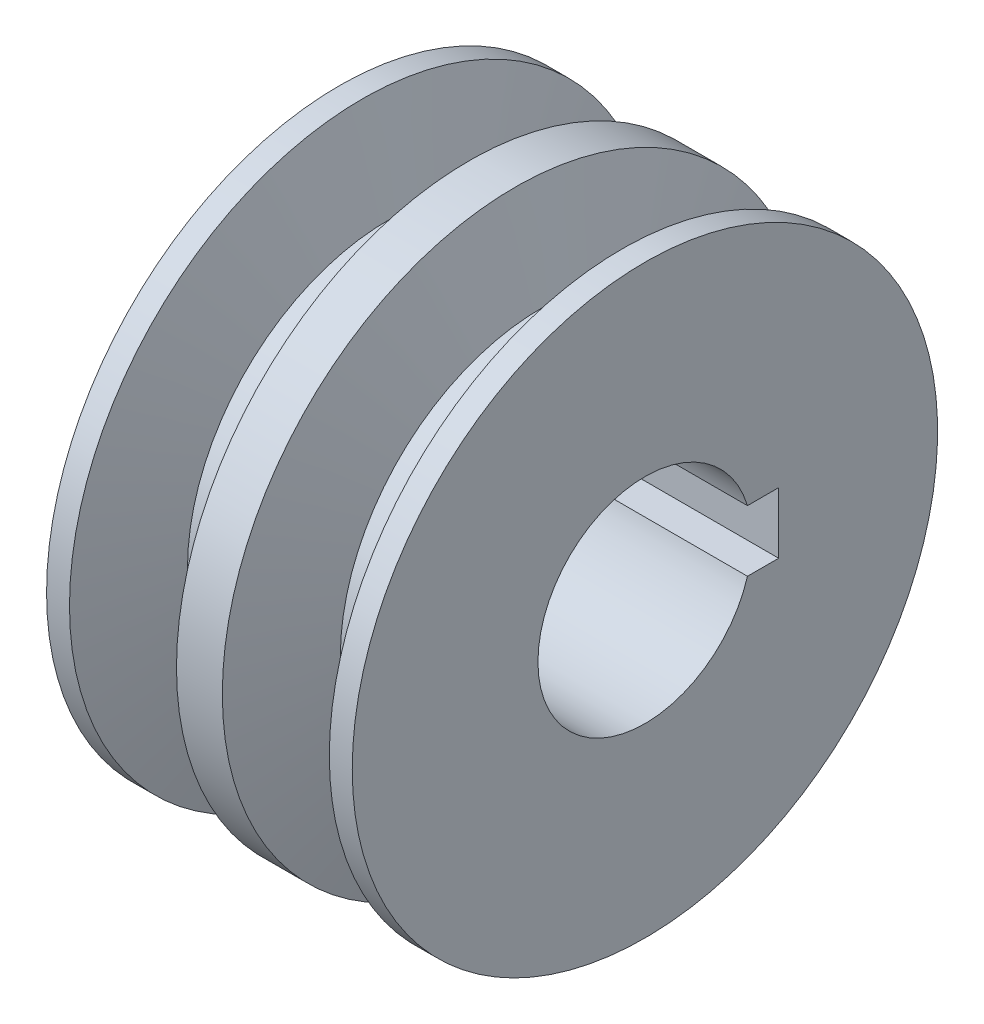
ISO-10303-21;
HEADER;
FILE_DESCRIPTION(('STEP AP214'),'2;1');
FILE_NAME('part.step','',(''),(''),'','','');
FILE_SCHEMA(('AUTOMOTIVE_DESIGN { 1 0 10303 214 1 1 1 1 }'));
ENDSEC;
DATA;
#1=APPLICATION_CONTEXT('core data for automotive mechanical design processes');
#2=APPLICATION_PROTOCOL_DEFINITION('international standard','automotive_design',2000,#1);
#3=PRODUCT_CONTEXT('',#1,'mechanical');
#4=PRODUCT('Part','Part','',(#3));
#5=PRODUCT_RELATED_PRODUCT_CATEGORY('part','',(#4));
#6=PRODUCT_DEFINITION_FORMATION('','',#4);
#7=PRODUCT_DEFINITION_CONTEXT('part definition',#1,'design');
#8=PRODUCT_DEFINITION('design','',#6,#7);
#9=PRODUCT_DEFINITION_SHAPE('','',#8);
#10=(LENGTH_UNIT() NAMED_UNIT(*) SI_UNIT(.MILLI.,.METRE.));
#11=(NAMED_UNIT(*) PLANE_ANGLE_UNIT() SI_UNIT($,.RADIAN.));
#12=(NAMED_UNIT(*) SI_UNIT($,.STERADIAN.) SOLID_ANGLE_UNIT());
#13=UNCERTAINTY_MEASURE_WITH_UNIT(LENGTH_MEASURE(1.E-05),#10,'distance_accuracy_value','');
#14=(GEOMETRIC_REPRESENTATION_CONTEXT(3) GLOBAL_UNCERTAINTY_ASSIGNED_CONTEXT((#13)) GLOBAL_UNIT_ASSIGNED_CONTEXT((#10,
#11,#12)) REPRESENTATION_CONTEXT('',''));
#15=CARTESIAN_POINT('',(0.,0.,0.));
#16=DIRECTION('',(0.,0.,1.));
#17=DIRECTION('',(1.,0.,0.));
#18=AXIS2_PLACEMENT_3D('',#15,#16,#17);
#19=CARTESIAN_POINT('',(985.254127108371,38.3000000000001,414.673045166986));
#20=DIRECTION('',(1.,0.,0.));
#21=DIRECTION('',(0.,0.,-1.));
#22=AXIS2_PLACEMENT_3D('',#19,#20,#21);
#23=PLANE('',#22);
#24=CARTESIAN_POINT('',(985.254127108371,0.,414.673045166986));
#25=DIRECTION('',(-1.,0.,0.));
#26=DIRECTION('',(0.,0.,1.));
#27=AXIS2_PLACEMENT_3D('',#24,#25,#26);
#28=CIRCLE('',#27,38.3000000000001);
#29=CARTESIAN_POINT('',(985.254127108371,0.,452.973045166986));
#30=VERTEX_POINT('',#29);
#31=EDGE_CURVE('E11',#30,#30,#28,.T.);
#32=ORIENTED_EDGE('',*,*,#31,.F.);
#33=EDGE_LOOP('',(#32));
#34=FACE_BOUND('',#33,.T.);
#35=DIRECTION('',(0.,-1.,0.));
#36=VECTOR('',#35,1.);
#37=CARTESIAN_POINT('',(985.254127108371,0.,397.173045166986));
#38=LINE('',#37,#36);
#39=CARTESIAN_POINT('',(985.254127108371,4.,397.173045166986));
#40=VERTEX_POINT('',#39);
#41=CARTESIAN_POINT('',(985.254127108371,-4.,397.173045166986));
#42=VERTEX_POINT('',#41);
#43=EDGE_CURVE('E92',#40,#42,#38,.T.);
#44=ORIENTED_EDGE('',*,*,#43,.T.);
#45=DIRECTION('',(0.,0.,1.));
#46=VECTOR('',#45,1.);
#47=CARTESIAN_POINT('',(985.254127108371,-4.,-1.29601113280521E-12));
#48=LINE('',#47,#46);
#49=CARTESIAN_POINT('',(985.254127108371,-4.,401.256637301987));
#50=VERTEX_POINT('',#49);
#51=EDGE_CURVE('E98',#42,#50,#48,.T.);
#52=ORIENTED_EDGE('',*,*,#51,.T.);
#53=CARTESIAN_POINT('',(985.254127108371,0.,414.673045166986));
#54=DIRECTION('',(1.,0.,0.));
#55=DIRECTION('',(0.,0.,-1.));
#56=AXIS2_PLACEMENT_3D('',#53,#54,#55);
#57=CIRCLE('',#56,14.);
#58=CARTESIAN_POINT('',(985.254127108371,4.,401.256637301987));
#59=VERTEX_POINT('',#58);
#60=EDGE_CURVE('E103',#59,#50,#57,.T.);
#61=ORIENTED_EDGE('',*,*,#60,.F.);
#62=DIRECTION('',(0.,0.,-1.));
#63=VECTOR('',#62,1.);
#64=CARTESIAN_POINT('',(985.254127108371,4.,-1.29601113280521E-12));
#65=LINE('',#64,#63);
#66=EDGE_CURVE('E48',#59,#40,#65,.T.);
#67=ORIENTED_EDGE('',*,*,#66,.T.);
#68=EDGE_LOOP('',(#44,#52,#61,#67));
#69=FACE_BOUND('',#68,.T.);
#70=ADVANCED_FACE('F33',(#34,#69),#23,.T.);
#71=CARTESIAN_POINT('',(945.254127108371,0.,414.673045166986));
#72=DIRECTION('',(-1.,0.,0.));
#73=DIRECTION('',(0.,0.,1.));
#74=AXIS2_PLACEMENT_3D('',#71,#72,#73);
#75=PLANE('',#74);
#76=CARTESIAN_POINT('',(945.254127108371,0.,414.673045166986));
#77=DIRECTION('',(-1.,0.,0.));
#78=DIRECTION('',(0.,0.,1.));
#79=AXIS2_PLACEMENT_3D('',#76,#77,#78);
#80=CIRCLE('',#79,38.3);
#81=CARTESIAN_POINT('',(945.254127108371,0.,452.973045166986));
#82=VERTEX_POINT('',#81);
#83=EDGE_CURVE('E41',#82,#82,#80,.T.);
#84=ORIENTED_EDGE('',*,*,#83,.T.);
#85=EDGE_LOOP('',(#84));
#86=FACE_BOUND('',#85,.T.);
#87=CARTESIAN_POINT('',(945.254127108371,0.,414.673045166986));
#88=DIRECTION('',(1.,0.,0.));
#89=DIRECTION('',(0.,0.,-1.));
#90=AXIS2_PLACEMENT_3D('',#87,#88,#89);
#91=CIRCLE('',#90,14.);
#92=CARTESIAN_POINT('',(945.254127108371,4.,401.256637301987));
#93=VERTEX_POINT('',#92);
#94=CARTESIAN_POINT('',(945.254127108371,-4.,401.256637301987));
#95=VERTEX_POINT('',#94);
#96=EDGE_CURVE('E106',#93,#95,#91,.T.);
#97=ORIENTED_EDGE('',*,*,#96,.T.);
#98=DIRECTION('',(0.,0.,1.));
#99=VECTOR('',#98,1.);
#100=CARTESIAN_POINT('',(945.254127108371,-4.,-1.24049998157395E-12));
#101=LINE('',#100,#99);
#102=CARTESIAN_POINT('',(945.254127108371,-4.,397.173045166986));
#103=VERTEX_POINT('',#102);
#104=EDGE_CURVE('E57',#103,#95,#101,.T.);
#105=ORIENTED_EDGE('',*,*,#104,.F.);
#106=DIRECTION('',(0.,-1.,0.));
#107=VECTOR('',#106,1.);
#108=CARTESIAN_POINT('',(945.254127108371,0.,397.173045166986));
#109=LINE('',#108,#107);
#110=CARTESIAN_POINT('',(945.254127108371,4.,397.173045166986));
#111=VERTEX_POINT('',#110);
#112=EDGE_CURVE('E77',#111,#103,#109,.T.);
#113=ORIENTED_EDGE('',*,*,#112,.F.);
#114=DIRECTION('',(0.,0.,-1.));
#115=VECTOR('',#114,1.);
#116=CARTESIAN_POINT('',(945.254127108371,4.,-1.24049998157395E-12));
#117=LINE('',#116,#115);
#118=EDGE_CURVE('E80',#93,#111,#117,.T.);
#119=ORIENTED_EDGE('',*,*,#118,.F.);
#120=EDGE_LOOP('',(#97,#105,#113,#119));
#121=FACE_BOUND('',#120,.T.);
#122=ADVANCED_FACE('F94',(#86,#121),#75,.T.);
#123=CARTESIAN_POINT('',(945.254127108371,0.,414.673045166986));
#124=DIRECTION('',(1.,0.,0.));
#125=DIRECTION('',(0.,0.,-1.));
#126=AXIS2_PLACEMENT_3D('',#123,#124,#125);
#127=CYLINDRICAL_SURFACE('',#126,14.);
#128=DIRECTION('',(1.,0.,0.));
#129=VECTOR('',#128,1.);
#130=CARTESIAN_POINT('',(945.254127108371,-4.,401.256637301987));
#131=LINE('',#130,#129);
#132=EDGE_CURVE('E70',#95,#50,#131,.T.);
#133=ORIENTED_EDGE('',*,*,#132,.F.);
#134=ORIENTED_EDGE('',*,*,#96,.F.);
#135=DIRECTION('',(1.,0.,0.));
#136=VECTOR('',#135,1.);
#137=CARTESIAN_POINT('',(945.254127108371,4.,401.256637301987));
#138=LINE('',#137,#136);
#139=EDGE_CURVE('E84',#93,#59,#138,.T.);
#140=ORIENTED_EDGE('',*,*,#139,.T.);
#141=ORIENTED_EDGE('',*,*,#60,.T.);
#142=EDGE_LOOP('',(#133,#134,#140,#141));
#143=FACE_BOUND('',#142,.T.);
#144=ADVANCED_FACE('F149',(#143),#127,.F.);
#145=CARTESIAN_POINT('',(985.254127108371,0.,414.673045166986));
#146=DIRECTION('',(-1.,0.,0.));
#147=DIRECTION('',(0.,0.,1.));
#148=AXIS2_PLACEMENT_3D('',#145,#146,#147);
#149=CYLINDRICAL_SURFACE('',#148,38.3);
#150=ORIENTED_EDGE('',*,*,#31,.T.);
#151=EDGE_LOOP('',(#150));
#152=FACE_BOUND('',#151,.T.);
#153=CARTESIAN_POINT('',(982.254127108371,0.,414.673045166986));
#154=DIRECTION('',(-1.,0.,0.));
#155=DIRECTION('',(0.,0.,1.));
#156=AXIS2_PLACEMENT_3D('',#153,#154,#155);
#157=CIRCLE('',#156,38.2999999999999);
#158=CARTESIAN_POINT('',(982.254127108371,0.,452.973045166986));
#159=VERTEX_POINT('',#158);
#160=EDGE_CURVE('E108',#159,#159,#157,.T.);
#161=ORIENTED_EDGE('',*,*,#160,.F.);
#162=EDGE_LOOP('',(#161));
#163=FACE_BOUND('',#162,.T.);
#164=ADVANCED_FACE('F35',(#152,#163),#149,.T.);
#165=CARTESIAN_POINT('',(985.254127108371,0.,414.673045166986));
#166=DIRECTION('',(-1.,0.,0.));
#167=DIRECTION('',(0.,0.,1.));
#168=AXIS2_PLACEMENT_3D('',#165,#166,#167);
#169=CYLINDRICAL_SURFACE('',#168,38.3);
#170=CARTESIAN_POINT('',(948.254127108371,0.,414.673045166986));
#171=DIRECTION('',(-1.,0.,0.));
#172=DIRECTION('',(0.,0.,1.));
#173=AXIS2_PLACEMENT_3D('',#170,#171,#172);
#174=CIRCLE('',#173,38.3);
#175=CARTESIAN_POINT('',(948.254127108371,0.,452.973045166986));
#176=VERTEX_POINT('',#175);
#177=EDGE_CURVE('E131',#176,#176,#174,.T.);
#178=ORIENTED_EDGE('',*,*,#177,.T.);
#179=EDGE_LOOP('',(#178));
#180=FACE_BOUND('',#179,.T.);
#181=ORIENTED_EDGE('',*,*,#83,.F.);
#182=EDGE_LOOP('',(#181));
#183=FACE_BOUND('',#182,.T.);
#184=ADVANCED_FACE('F137',(#180,#183),#169,.T.);
#185=CARTESIAN_POINT('',(948.254127108371,0.,414.673045166986));
#186=DIRECTION('',(-1.,0.,0.));
#187=DIRECTION('',(0.,0.,1.));
#188=AXIS2_PLACEMENT_3D('',#185,#186,#187);
#189=CONICAL_SURFACE('',#188,38.3,1.2915436464758);
#190=CARTESIAN_POINT('',(951.695071737477,0.,414.673045166986));
#191=DIRECTION('',(-1.,0.,0.));
#192=DIRECTION('',(0.,0.,1.));
#193=AXIS2_PLACEMENT_3D('',#190,#191,#192);
#194=CIRCLE('',#193,26.3);
#195=CARTESIAN_POINT('',(951.695071737477,0.,440.973045166986));
#196=VERTEX_POINT('',#195);
#197=EDGE_CURVE('E128',#196,#196,#194,.T.);
#198=ORIENTED_EDGE('',*,*,#197,.T.);
#199=EDGE_LOOP('',(#198));
#200=FACE_BOUND('',#199,.T.);
#201=ORIENTED_EDGE('',*,*,#177,.F.);
#202=EDGE_LOOP('',(#201));
#203=FACE_BOUND('',#202,.T.);
#204=ADVANCED_FACE('F139',(#200,#203),#189,.T.);
#205=CARTESIAN_POINT('',(985.254127108371,0.,414.673045166986));
#206=DIRECTION('',(-1.,0.,0.));
#207=DIRECTION('',(0.,0.,1.));
#208=AXIS2_PLACEMENT_3D('',#205,#206,#207);
#209=CYLINDRICAL_SURFACE('',#208,26.3);
#210=CARTESIAN_POINT('',(958.813182479266,0.,414.673045166986));
#211=DIRECTION('',(-1.,0.,0.));
#212=DIRECTION('',(0.,0.,1.));
#213=AXIS2_PLACEMENT_3D('',#210,#211,#212);
#214=CIRCLE('',#213,26.3);
#215=CARTESIAN_POINT('',(958.813182479266,0.,440.973045166986));
#216=VERTEX_POINT('',#215);
#217=EDGE_CURVE('E125',#216,#216,#214,.T.);
#218=ORIENTED_EDGE('',*,*,#217,.T.);
#219=EDGE_LOOP('',(#218));
#220=FACE_BOUND('',#219,.T.);
#221=ORIENTED_EDGE('',*,*,#197,.F.);
#222=EDGE_LOOP('',(#221));
#223=FACE_BOUND('',#222,.T.);
#224=ADVANCED_FACE('F146',(#220,#223),#209,.T.);
#225=CARTESIAN_POINT('',(958.813182479266,0.,414.673045166986));
#226=DIRECTION('',(1.,0.,0.));
#227=DIRECTION('',(0.,0.,-1.));
#228=AXIS2_PLACEMENT_3D('',#225,#226,#227);
#229=CONICAL_SURFACE('',#228,26.3,1.2915436464758);
#230=CARTESIAN_POINT('',(962.254127108371,0.,414.673045166986));
#231=DIRECTION('',(-1.,0.,0.));
#232=DIRECTION('',(0.,0.,1.));
#233=AXIS2_PLACEMENT_3D('',#230,#231,#232);
#234=CIRCLE('',#233,38.2999999999999);
#235=CARTESIAN_POINT('',(962.254127108371,0.,452.973045166986));
#236=VERTEX_POINT('',#235);
#237=EDGE_CURVE('E122',#236,#236,#234,.T.);
#238=ORIENTED_EDGE('',*,*,#237,.T.);
#239=EDGE_LOOP('',(#238));
#240=FACE_BOUND('',#239,.T.);
#241=ORIENTED_EDGE('',*,*,#217,.F.);
#242=EDGE_LOOP('',(#241));
#243=FACE_BOUND('',#242,.T.);
#244=ADVANCED_FACE('F184',(#240,#243),#229,.T.);
#245=CARTESIAN_POINT('',(985.254127108371,0.,414.673045166986));
#246=DIRECTION('',(-1.,0.,0.));
#247=DIRECTION('',(0.,0.,1.));
#248=AXIS2_PLACEMENT_3D('',#245,#246,#247);
#249=CYLINDRICAL_SURFACE('',#248,38.2999999999999);
#250=CARTESIAN_POINT('',(968.254127108371,0.,414.673045166986));
#251=DIRECTION('',(-1.,0.,0.));
#252=DIRECTION('',(0.,0.,1.));
#253=AXIS2_PLACEMENT_3D('',#250,#251,#252);
#254=CIRCLE('',#253,38.3);
#255=CARTESIAN_POINT('',(968.254127108371,0.,452.973045166986));
#256=VERTEX_POINT('',#255);
#257=EDGE_CURVE('E119',#256,#256,#254,.T.);
#258=ORIENTED_EDGE('',*,*,#257,.T.);
#259=EDGE_LOOP('',(#258));
#260=FACE_BOUND('',#259,.T.);
#261=ORIENTED_EDGE('',*,*,#237,.F.);
#262=EDGE_LOOP('',(#261));
#263=FACE_BOUND('',#262,.T.);
#264=ADVANCED_FACE('F180',(#260,#263),#249,.T.);
#265=CARTESIAN_POINT('',(968.254127108371,0.,414.673045166986));
#266=DIRECTION('',(-1.,0.,0.));
#267=DIRECTION('',(0.,0.,1.));
#268=AXIS2_PLACEMENT_3D('',#265,#266,#267);
#269=CONICAL_SURFACE('',#268,38.3,1.2915436464758);
#270=CARTESIAN_POINT('',(971.695071737477,0.,414.673045166986));
#271=DIRECTION('',(-1.,0.,0.));
#272=DIRECTION('',(0.,0.,1.));
#273=AXIS2_PLACEMENT_3D('',#270,#271,#272);
#274=CIRCLE('',#273,26.3);
#275=CARTESIAN_POINT('',(971.695071737477,0.,440.973045166986));
#276=VERTEX_POINT('',#275);
#277=EDGE_CURVE('E116',#276,#276,#274,.T.);
#278=ORIENTED_EDGE('',*,*,#277,.T.);
#279=EDGE_LOOP('',(#278));
#280=FACE_BOUND('',#279,.T.);
#281=ORIENTED_EDGE('',*,*,#257,.F.);
#282=EDGE_LOOP('',(#281));
#283=FACE_BOUND('',#282,.T.);
#284=ADVANCED_FACE('F176',(#280,#283),#269,.T.);
#285=CARTESIAN_POINT('',(985.254127108371,0.,414.673045166986));
#286=DIRECTION('',(-1.,0.,0.));
#287=DIRECTION('',(0.,0.,1.));
#288=AXIS2_PLACEMENT_3D('',#285,#286,#287);
#289=CYLINDRICAL_SURFACE('',#288,26.3);
#290=CARTESIAN_POINT('',(978.813182479266,0.,414.673045166986));
#291=DIRECTION('',(-1.,0.,0.));
#292=DIRECTION('',(0.,0.,1.));
#293=AXIS2_PLACEMENT_3D('',#290,#291,#292);
#294=CIRCLE('',#293,26.3);
#295=CARTESIAN_POINT('',(978.813182479266,0.,440.973045166986));
#296=VERTEX_POINT('',#295);
#297=EDGE_CURVE('E113',#296,#296,#294,.T.);
#298=ORIENTED_EDGE('',*,*,#297,.T.);
#299=EDGE_LOOP('',(#298));
#300=FACE_BOUND('',#299,.T.);
#301=ORIENTED_EDGE('',*,*,#277,.F.);
#302=EDGE_LOOP('',(#301));
#303=FACE_BOUND('',#302,.T.);
#304=ADVANCED_FACE('F172',(#300,#303),#289,.T.);
#305=CARTESIAN_POINT('',(978.813182479266,0.,414.673045166986));
#306=DIRECTION('',(1.,0.,0.));
#307=DIRECTION('',(0.,0.,-1.));
#308=AXIS2_PLACEMENT_3D('',#305,#306,#307);
#309=CONICAL_SURFACE('',#308,26.3,1.29154364647581);
#310=ORIENTED_EDGE('',*,*,#160,.T.);
#311=EDGE_LOOP('',(#310));
#312=FACE_BOUND('',#311,.T.);
#313=ORIENTED_EDGE('',*,*,#297,.F.);
#314=EDGE_LOOP('',(#313));
#315=FACE_BOUND('',#314,.T.);
#316=ADVANCED_FACE('F169',(#312,#315),#309,.T.);
#317=CARTESIAN_POINT('',(945.254127108371,-4.,-1.24049998157395E-12));
#318=DIRECTION('',(0.,1.,0.));
#319=DIRECTION('',(0.,0.,1.));
#320=AXIS2_PLACEMENT_3D('',#317,#318,#319);
#321=PLANE('',#320);
#322=ORIENTED_EDGE('',*,*,#51,.F.);
#323=DIRECTION('',(1.,0.,0.));
#324=VECTOR('',#323,1.);
#325=CARTESIAN_POINT('',(945.254127108371,-4.,397.173045166986));
#326=LINE('',#325,#324);
#327=EDGE_CURVE('E88',#103,#42,#326,.T.);
#328=ORIENTED_EDGE('',*,*,#327,.F.);
#329=ORIENTED_EDGE('',*,*,#104,.T.);
#330=ORIENTED_EDGE('',*,*,#132,.T.);
#331=EDGE_LOOP('',(#322,#328,#329,#330));
#332=FACE_BOUND('',#331,.T.);
#333=ADVANCED_FACE('F167',(#332),#321,.T.);
#334=CARTESIAN_POINT('',(945.254127108371,4.,-1.24049998157395E-12));
#335=DIRECTION('',(0.,-1.,0.));
#336=DIRECTION('',(0.,0.,-1.));
#337=AXIS2_PLACEMENT_3D('',#334,#335,#336);
#338=PLANE('',#337);
#339=ORIENTED_EDGE('',*,*,#66,.F.);
#340=ORIENTED_EDGE('',*,*,#139,.F.);
#341=ORIENTED_EDGE('',*,*,#118,.T.);
#342=DIRECTION('',(1.,0.,0.));
#343=VECTOR('',#342,1.);
#344=CARTESIAN_POINT('',(945.254127108371,4.,397.173045166986));
#345=LINE('',#344,#343);
#346=EDGE_CURVE('E82',#111,#40,#345,.T.);
#347=ORIENTED_EDGE('',*,*,#346,.T.);
#348=EDGE_LOOP('',(#339,#340,#341,#347));
#349=FACE_BOUND('',#348,.T.);
#350=ADVANCED_FACE('F81',(#349),#338,.T.);
#351=CARTESIAN_POINT('',(945.254127108371,0.,397.173045166986));
#352=DIRECTION('',(0.,0.,1.));
#353=DIRECTION('',(1.,0.,0.));
#354=AXIS2_PLACEMENT_3D('',#351,#352,#353);
#355=PLANE('',#354);
#356=ORIENTED_EDGE('',*,*,#43,.F.);
#357=ORIENTED_EDGE('',*,*,#346,.F.);
#358=ORIENTED_EDGE('',*,*,#112,.T.);
#359=ORIENTED_EDGE('',*,*,#327,.T.);
#360=EDGE_LOOP('',(#356,#357,#358,#359));
#361=FACE_BOUND('',#360,.T.);
#362=ADVANCED_FACE('F90',(#361),#355,.T.);
#363=CLOSED_SHELL('',(#70,#122,#144,#164,#184,#204,#224,#244,#264,#284,#304,#316,#333,#350,#362));
#364=MANIFOLD_SOLID_BREP('B2',#363);
#365=ADVANCED_BREP_SHAPE_REPRESENTATION('',(#18,#364),#14);
#366=SHAPE_DEFINITION_REPRESENTATION(#9,#365);
ENDSEC;
END-ISO-10303-21;
